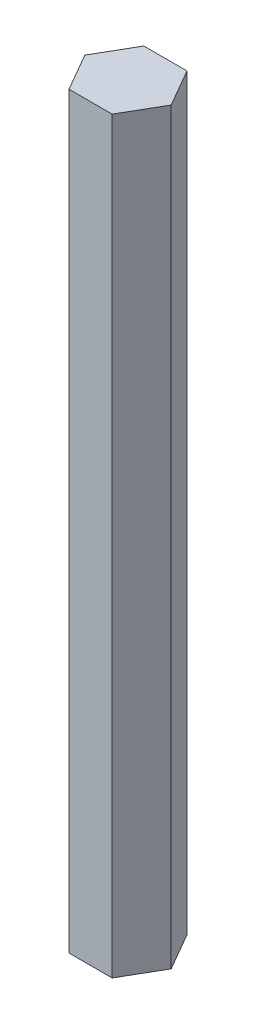
ISO-10303-21;
HEADER;
FILE_DESCRIPTION(('STEP AP214'),'2;1');
FILE_NAME('part.step','',(''),(''),'','','');
FILE_SCHEMA(('AUTOMOTIVE_DESIGN { 1 0 10303 214 1 1 1 1 }'));
ENDSEC;
DATA;
#1=APPLICATION_CONTEXT('core data for automotive mechanical design processes');
#2=APPLICATION_PROTOCOL_DEFINITION('international standard','automotive_design',2000,#1);
#3=PRODUCT_CONTEXT('',#1,'mechanical');
#4=PRODUCT('Part','Part','',(#3));
#5=PRODUCT_RELATED_PRODUCT_CATEGORY('part','',(#4));
#6=PRODUCT_DEFINITION_FORMATION('','',#4);
#7=PRODUCT_DEFINITION_CONTEXT('part definition',#1,'design');
#8=PRODUCT_DEFINITION('design','',#6,#7);
#9=PRODUCT_DEFINITION_SHAPE('','',#8);
#10=(LENGTH_UNIT() NAMED_UNIT(*) SI_UNIT(.MILLI.,.METRE.));
#11=(NAMED_UNIT(*) PLANE_ANGLE_UNIT() SI_UNIT($,.RADIAN.));
#12=(NAMED_UNIT(*) SI_UNIT($,.STERADIAN.) SOLID_ANGLE_UNIT());
#13=UNCERTAINTY_MEASURE_WITH_UNIT(LENGTH_MEASURE(1.E-05),#10,'distance_accuracy_value','');
#14=(GEOMETRIC_REPRESENTATION_CONTEXT(3) GLOBAL_UNCERTAINTY_ASSIGNED_CONTEXT((#13)) GLOBAL_UNIT_ASSIGNED_CONTEXT((#10,
#11,#12)) REPRESENTATION_CONTEXT('',''));
#15=CARTESIAN_POINT('',(0.,0.,0.));
#16=DIRECTION('',(0.,0.,1.));
#17=DIRECTION('',(1.,0.,0.));
#18=AXIS2_PLACEMENT_3D('',#15,#16,#17);
#19=CARTESIAN_POINT('',(0.866025403784429,30.,1.50000000000002));
#20=DIRECTION('',(-0.866025403784438,0.,-0.500000000000001));
#21=DIRECTION('',(-0.500000000000001,0.,0.866025403784438));
#22=AXIS2_PLACEMENT_3D('',#19,#20,#21);
#23=PLANE('',#22);
#24=DIRECTION('',(0.500000000000001,0.,-0.866025403784438));
#25=VECTOR('',#24,1.);
#26=CARTESIAN_POINT('',(0.866025403784429,0.,1.50000000000002));
#27=LINE('',#26,#25);
#28=CARTESIAN_POINT('',(0.866025403784429,0.,1.50000000000002));
#29=VERTEX_POINT('',#28);
#30=CARTESIAN_POINT('',(1.73205080756888,0.,0.));
#31=VERTEX_POINT('',#30);
#32=EDGE_CURVE('E122',#29,#31,#27,.T.);
#33=ORIENTED_EDGE('',*,*,#32,.T.);
#34=DIRECTION('',(0.,-1.,0.));
#35=VECTOR('',#34,1.);
#36=CARTESIAN_POINT('',(1.73205080756888,30.,0.));
#37=LINE('',#36,#35);
#38=CARTESIAN_POINT('',(1.73205080756888,30.,0.));
#39=VERTEX_POINT('',#38);
#40=EDGE_CURVE('E11',#39,#31,#37,.T.);
#41=ORIENTED_EDGE('',*,*,#40,.F.);
#42=DIRECTION('',(0.500000000000001,0.,-0.866025403784438));
#43=VECTOR('',#42,1.);
#44=CARTESIAN_POINT('',(0.866025403784429,30.,1.50000000000002));
#45=LINE('',#44,#43);
#46=CARTESIAN_POINT('',(0.866025403784429,30.,1.50000000000002));
#47=VERTEX_POINT('',#46);
#48=EDGE_CURVE('E132',#47,#39,#45,.T.);
#49=ORIENTED_EDGE('',*,*,#48,.F.);
#50=DIRECTION('',(0.,-1.,0.));
#51=VECTOR('',#50,1.);
#52=CARTESIAN_POINT('',(0.866025403784429,30.,1.50000000000002));
#53=LINE('',#52,#51);
#54=EDGE_CURVE('E118',#47,#29,#53,.T.);
#55=ORIENTED_EDGE('',*,*,#54,.T.);
#56=EDGE_LOOP('',(#33,#41,#49,#55));
#57=FACE_BOUND('',#56,.T.);
#58=ADVANCED_FACE('F38',(#57),#23,.F.);
#59=CARTESIAN_POINT('',(1.73205080756888,30.,0.));
#60=DIRECTION('',(-0.866025403784441,0.,0.499999999999996));
#61=DIRECTION('',(0.499999999999996,0.,0.866025403784441));
#62=AXIS2_PLACEMENT_3D('',#59,#60,#61);
#63=PLANE('',#62);
#64=DIRECTION('',(-0.499999999999996,0.,-0.866025403784441));
#65=VECTOR('',#64,1.);
#66=CARTESIAN_POINT('',(1.73205080756888,0.,0.));
#67=LINE('',#66,#65);
#68=CARTESIAN_POINT('',(0.866025403784425,0.,-1.50000000000004));
#69=VERTEX_POINT('',#68);
#70=EDGE_CURVE('E125',#31,#69,#67,.T.);
#71=ORIENTED_EDGE('',*,*,#70,.T.);
#72=DIRECTION('',(0.,-1.,0.));
#73=VECTOR('',#72,1.);
#74=CARTESIAN_POINT('',(0.866025403784425,30.,-1.50000000000004));
#75=LINE('',#74,#73);
#76=CARTESIAN_POINT('',(0.866025403784425,30.,-1.50000000000004));
#77=VERTEX_POINT('',#76);
#78=EDGE_CURVE('E46',#77,#69,#75,.T.);
#79=ORIENTED_EDGE('',*,*,#78,.F.);
#80=DIRECTION('',(-0.499999999999996,0.,-0.866025403784441));
#81=VECTOR('',#80,1.);
#82=CARTESIAN_POINT('',(1.73205080756888,30.,0.));
#83=LINE('',#82,#81);
#84=EDGE_CURVE('E91',#39,#77,#83,.T.);
#85=ORIENTED_EDGE('',*,*,#84,.F.);
#86=ORIENTED_EDGE('',*,*,#40,.T.);
#87=EDGE_LOOP('',(#71,#79,#85,#86));
#88=FACE_BOUND('',#87,.T.);
#89=ADVANCED_FACE('F156',(#88),#63,.F.);
#90=CARTESIAN_POINT('',(0.866025403784425,30.,-1.50000000000004));
#91=DIRECTION('',(0.,0.,1.));
#92=DIRECTION('',(1.,0.,0.));
#93=AXIS2_PLACEMENT_3D('',#90,#91,#92);
#94=PLANE('',#93);
#95=DIRECTION('',(-1.,0.,0.));
#96=VECTOR('',#95,1.);
#97=CARTESIAN_POINT('',(0.866025403784425,0.,-1.50000000000004));
#98=LINE('',#97,#96);
#99=CARTESIAN_POINT('',(-0.866025403784439,0.,-1.50000000000004));
#100=VERTEX_POINT('',#99);
#101=EDGE_CURVE('E127',#69,#100,#98,.T.);
#102=ORIENTED_EDGE('',*,*,#101,.T.);
#103=DIRECTION('',(0.,-1.,0.));
#104=VECTOR('',#103,1.);
#105=CARTESIAN_POINT('',(-0.866025403784439,30.,-1.50000000000004));
#106=LINE('',#105,#104);
#107=CARTESIAN_POINT('',(-0.866025403784439,30.,-1.50000000000004));
#108=VERTEX_POINT('',#107);
#109=EDGE_CURVE('E113',#108,#100,#106,.T.);
#110=ORIENTED_EDGE('',*,*,#109,.F.);
#111=DIRECTION('',(-1.,0.,0.));
#112=VECTOR('',#111,1.);
#113=CARTESIAN_POINT('',(0.866025403784425,30.,-1.50000000000004));
#114=LINE('',#113,#112);
#115=EDGE_CURVE('E104',#77,#108,#114,.T.);
#116=ORIENTED_EDGE('',*,*,#115,.F.);
#117=ORIENTED_EDGE('',*,*,#78,.T.);
#118=EDGE_LOOP('',(#102,#110,#116,#117));
#119=FACE_BOUND('',#118,.T.);
#120=ADVANCED_FACE('F138',(#119),#94,.F.);
#121=CARTESIAN_POINT('',(-0.866025403784439,30.,-1.50000000000004));
#122=DIRECTION('',(0.866025403784439,0.,0.5));
#123=DIRECTION('',(0.5,0.,-0.866025403784439));
#124=AXIS2_PLACEMENT_3D('',#121,#122,#123);
#125=PLANE('',#124);
#126=DIRECTION('',(-0.5,0.,0.866025403784439));
#127=VECTOR('',#126,1.);
#128=CARTESIAN_POINT('',(-0.866025403784439,0.,-1.50000000000004));
#129=LINE('',#128,#127);
#130=CARTESIAN_POINT('',(-1.7320508075689,0.,0.));
#131=VERTEX_POINT('',#130);
#132=EDGE_CURVE('E112',#100,#131,#129,.T.);
#133=ORIENTED_EDGE('',*,*,#132,.T.);
#134=DIRECTION('',(0.,-1.,0.));
#135=VECTOR('',#134,1.);
#136=CARTESIAN_POINT('',(-1.7320508075689,30.,0.));
#137=LINE('',#136,#135);
#138=CARTESIAN_POINT('',(-1.7320508075689,30.,0.));
#139=VERTEX_POINT('',#138);
#140=EDGE_CURVE('E109',#139,#131,#137,.T.);
#141=ORIENTED_EDGE('',*,*,#140,.F.);
#142=DIRECTION('',(-0.5,0.,0.866025403784439));
#143=VECTOR('',#142,1.);
#144=CARTESIAN_POINT('',(-0.866025403784439,30.,-1.50000000000004));
#145=LINE('',#144,#143);
#146=EDGE_CURVE('E98',#108,#139,#145,.T.);
#147=ORIENTED_EDGE('',*,*,#146,.F.);
#148=ORIENTED_EDGE('',*,*,#109,.T.);
#149=EDGE_LOOP('',(#133,#141,#147,#148));
#150=FACE_BOUND('',#149,.T.);
#151=ADVANCED_FACE('F110',(#150),#125,.F.);
#152=CARTESIAN_POINT('',(-1.7320508075689,30.,0.));
#153=DIRECTION('',(0.866025403784439,0.,-0.5));
#154=DIRECTION('',(-0.5,0.,-0.866025403784439));
#155=AXIS2_PLACEMENT_3D('',#152,#153,#154);
#156=PLANE('',#155);
#157=DIRECTION('',(0.5,0.,0.866025403784439));
#158=VECTOR('',#157,1.);
#159=CARTESIAN_POINT('',(-1.7320508075689,0.,0.));
#160=LINE('',#159,#158);
#161=CARTESIAN_POINT('',(-0.86602540378445,0.,1.50000000000002));
#162=VERTEX_POINT('',#161);
#163=EDGE_CURVE('E77',#131,#162,#160,.T.);
#164=ORIENTED_EDGE('',*,*,#163,.T.);
#165=DIRECTION('',(0.,-1.,0.));
#166=VECTOR('',#165,1.);
#167=CARTESIAN_POINT('',(-0.86602540378445,30.,1.50000000000002));
#168=LINE('',#167,#166);
#169=CARTESIAN_POINT('',(-0.86602540378445,30.,1.50000000000002));
#170=VERTEX_POINT('',#169);
#171=EDGE_CURVE('E114',#170,#162,#168,.T.);
#172=ORIENTED_EDGE('',*,*,#171,.F.);
#173=DIRECTION('',(0.5,0.,0.866025403784439));
#174=VECTOR('',#173,1.);
#175=CARTESIAN_POINT('',(-1.7320508075689,30.,0.));
#176=LINE('',#175,#174);
#177=EDGE_CURVE('E102',#139,#170,#176,.T.);
#178=ORIENTED_EDGE('',*,*,#177,.F.);
#179=ORIENTED_EDGE('',*,*,#140,.T.);
#180=EDGE_LOOP('',(#164,#172,#178,#179));
#181=FACE_BOUND('',#180,.T.);
#182=ADVANCED_FACE('F116',(#181),#156,.F.);
#183=CARTESIAN_POINT('',(-0.86602540378445,30.,1.50000000000002));
#184=DIRECTION('',(0.,0.,-1.));
#185=DIRECTION('',(-1.,0.,0.));
#186=AXIS2_PLACEMENT_3D('',#183,#184,#185);
#187=PLANE('',#186);
#188=DIRECTION('',(1.,0.,0.));
#189=VECTOR('',#188,1.);
#190=CARTESIAN_POINT('',(-0.86602540378445,0.,1.50000000000002));
#191=LINE('',#190,#189);
#192=EDGE_CURVE('E83',#162,#29,#191,.T.);
#193=ORIENTED_EDGE('',*,*,#192,.T.);
#194=ORIENTED_EDGE('',*,*,#54,.F.);
#195=DIRECTION('',(1.,0.,0.));
#196=VECTOR('',#195,1.);
#197=CARTESIAN_POINT('',(-0.86602540378445,30.,1.50000000000002));
#198=LINE('',#197,#196);
#199=EDGE_CURVE('E54',#170,#47,#198,.T.);
#200=ORIENTED_EDGE('',*,*,#199,.F.);
#201=ORIENTED_EDGE('',*,*,#171,.T.);
#202=EDGE_LOOP('',(#193,#194,#200,#201));
#203=FACE_BOUND('',#202,.T.);
#204=ADVANCED_FACE('F145',(#203),#187,.F.);
#205=CARTESIAN_POINT('',(0.,30.,0.));
#206=DIRECTION('',(0.,1.,0.));
#207=DIRECTION('',(0.,0.,1.));
#208=AXIS2_PLACEMENT_3D('',#205,#206,#207);
#209=PLANE('',#208);
#210=ORIENTED_EDGE('',*,*,#48,.T.);
#211=ORIENTED_EDGE('',*,*,#84,.T.);
#212=ORIENTED_EDGE('',*,*,#115,.T.);
#213=ORIENTED_EDGE('',*,*,#146,.T.);
#214=ORIENTED_EDGE('',*,*,#177,.T.);
#215=ORIENTED_EDGE('',*,*,#199,.T.);
#216=EDGE_LOOP('',(#210,#211,#212,#213,#214,#215));
#217=FACE_BOUND('',#216,.T.);
#218=ADVANCED_FACE('F100',(#217),#209,.T.);
#219=CARTESIAN_POINT('',(0.,0.,0.));
#220=DIRECTION('',(0.,1.,0.));
#221=DIRECTION('',(0.,0.,1.));
#222=AXIS2_PLACEMENT_3D('',#219,#220,#221);
#223=PLANE('',#222);
#224=ORIENTED_EDGE('',*,*,#32,.F.);
#225=ORIENTED_EDGE('',*,*,#192,.F.);
#226=ORIENTED_EDGE('',*,*,#163,.F.);
#227=ORIENTED_EDGE('',*,*,#132,.F.);
#228=ORIENTED_EDGE('',*,*,#101,.F.);
#229=ORIENTED_EDGE('',*,*,#70,.F.);
#230=EDGE_LOOP('',(#224,#225,#226,#227,#228,#229));
#231=FACE_BOUND('',#230,.T.);
#232=ADVANCED_FACE('F141',(#231),#223,.F.);
#233=CLOSED_SHELL('',(#58,#89,#120,#151,#182,#204,#218,#232));
#234=MANIFOLD_SOLID_BREP('B2',#233);
#235=ADVANCED_BREP_SHAPE_REPRESENTATION('',(#18,#234),#14);
#236=SHAPE_DEFINITION_REPRESENTATION(#9,#235);
ENDSEC;
END-ISO-10303-21;
